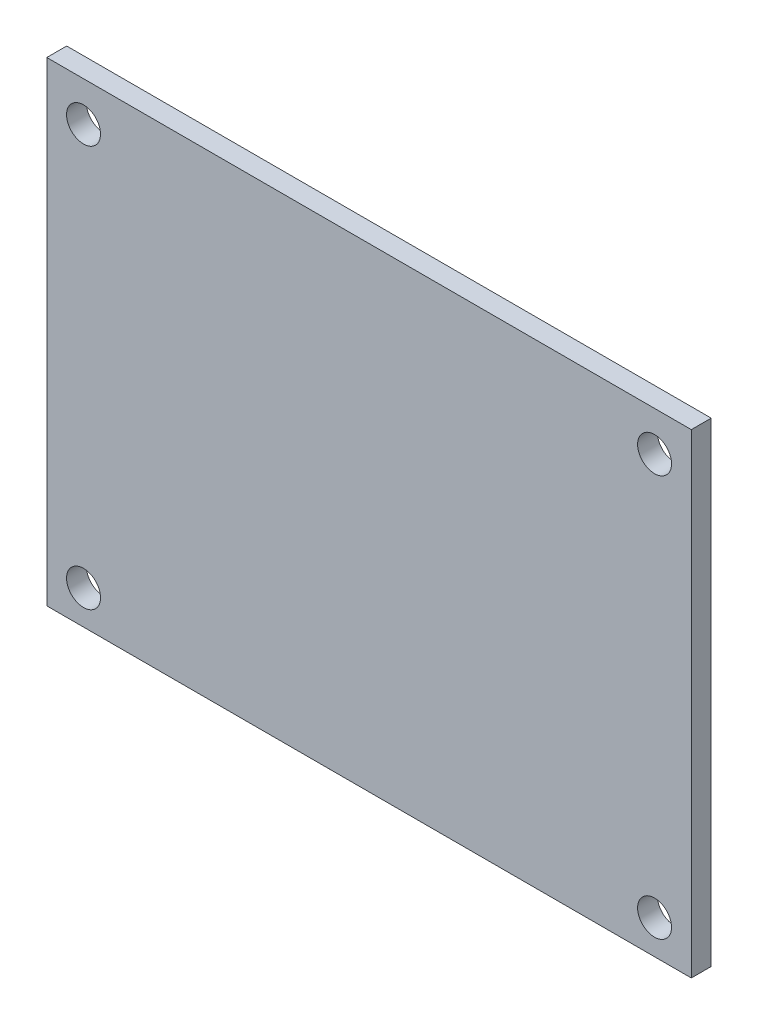
ISO-10303-21;
HEADER;
FILE_DESCRIPTION(('STEP AP214'),'2;1');
FILE_NAME('part.step','',(''),(''),'','','');
FILE_SCHEMA(('AUTOMOTIVE_DESIGN { 1 0 10303 214 1 1 1 1 }'));
ENDSEC;
DATA;
#1=APPLICATION_CONTEXT('core data for automotive mechanical design processes');
#2=APPLICATION_PROTOCOL_DEFINITION('international standard','automotive_design',2000,#1);
#3=PRODUCT_CONTEXT('',#1,'mechanical');
#4=PRODUCT('Part','Part','',(#3));
#5=PRODUCT_RELATED_PRODUCT_CATEGORY('part','',(#4));
#6=PRODUCT_DEFINITION_FORMATION('','',#4);
#7=PRODUCT_DEFINITION_CONTEXT('part definition',#1,'design');
#8=PRODUCT_DEFINITION('design','',#6,#7);
#9=PRODUCT_DEFINITION_SHAPE('','',#8);
#10=(LENGTH_UNIT() NAMED_UNIT(*) SI_UNIT(.MILLI.,.METRE.));
#11=(NAMED_UNIT(*) PLANE_ANGLE_UNIT() SI_UNIT($,.RADIAN.));
#12=(NAMED_UNIT(*) SI_UNIT($,.STERADIAN.) SOLID_ANGLE_UNIT());
#13=UNCERTAINTY_MEASURE_WITH_UNIT(LENGTH_MEASURE(1.E-05),#10,'distance_accuracy_value','');
#14=(GEOMETRIC_REPRESENTATION_CONTEXT(3) GLOBAL_UNCERTAINTY_ASSIGNED_CONTEXT((#13)) GLOBAL_UNIT_ASSIGNED_CONTEXT((#10,
#11,#12)) REPRESENTATION_CONTEXT('',''));
#15=CARTESIAN_POINT('',(0.,0.,0.));
#16=DIRECTION('',(0.,0.,1.));
#17=DIRECTION('',(1.,0.,0.));
#18=AXIS2_PLACEMENT_3D('',#15,#16,#17);
#19=CARTESIAN_POINT('',(28.5,21.,0.));
#20=DIRECTION('',(0.,0.,1.));
#21=DIRECTION('',(1.,0.,0.));
#22=AXIS2_PLACEMENT_3D('',#19,#20,#21);
#23=PLANE('',#22);
#24=CARTESIAN_POINT('',(53.75,3.,0.));
#25=DIRECTION('',(0.,0.,-1.));
#26=DIRECTION('',(1.,0.,0.));
#27=AXIS2_PLACEMENT_3D('',#24,#25,#26);
#28=CIRCLE('',#27,1.5);
#29=CARTESIAN_POINT('',(52.25,3.,0.));
#30=VERTEX_POINT('',#29);
#31=EDGE_CURVE('E132',#30,#30,#28,.T.);
#32=ORIENTED_EDGE('',*,*,#31,.F.);
#33=EDGE_LOOP('',(#32));
#34=FACE_BOUND('',#33,.T.);
#35=CARTESIAN_POINT('',(3.25,3.,0.));
#36=DIRECTION('',(0.,0.,-1.));
#37=DIRECTION('',(1.,0.,0.));
#38=AXIS2_PLACEMENT_3D('',#35,#36,#37);
#39=CIRCLE('',#38,1.5);
#40=CARTESIAN_POINT('',(1.75,3.,0.));
#41=VERTEX_POINT('',#40);
#42=EDGE_CURVE('E125',#41,#41,#39,.T.);
#43=ORIENTED_EDGE('',*,*,#42,.F.);
#44=EDGE_LOOP('',(#43));
#45=FACE_BOUND('',#44,.T.);
#46=CARTESIAN_POINT('',(53.75,38.5,0.));
#47=DIRECTION('',(0.,0.,-1.));
#48=DIRECTION('',(1.,0.,0.));
#49=AXIS2_PLACEMENT_3D('',#46,#47,#48);
#50=CIRCLE('',#49,1.5);
#51=CARTESIAN_POINT('',(52.25,38.5,0.));
#52=VERTEX_POINT('',#51);
#53=EDGE_CURVE('E150',#52,#52,#50,.T.);
#54=ORIENTED_EDGE('',*,*,#53,.F.);
#55=EDGE_LOOP('',(#54));
#56=FACE_BOUND('',#55,.T.);
#57=CARTESIAN_POINT('',(3.25,38.5,0.));
#58=DIRECTION('',(0.,0.,-1.));
#59=DIRECTION('',(1.,0.,0.));
#60=AXIS2_PLACEMENT_3D('',#57,#58,#59);
#61=CIRCLE('',#60,1.5);
#62=CARTESIAN_POINT('',(1.75,38.5,0.));
#63=VERTEX_POINT('',#62);
#64=EDGE_CURVE('E91',#63,#63,#61,.T.);
#65=ORIENTED_EDGE('',*,*,#64,.F.);
#66=EDGE_LOOP('',(#65));
#67=FACE_BOUND('',#66,.T.);
#68=DIRECTION('',(0.,-1.,0.));
#69=VECTOR('',#68,1.);
#70=CARTESIAN_POINT('',(0.,42.,0.));
#71=LINE('',#70,#69);
#72=CARTESIAN_POINT('',(0.,42.,0.));
#73=VERTEX_POINT('',#72);
#74=CARTESIAN_POINT('',(0.,0.,0.));
#75=VERTEX_POINT('',#74);
#76=EDGE_CURVE('E25',#73,#75,#71,.T.);
#77=ORIENTED_EDGE('',*,*,#76,.F.);
#78=DIRECTION('',(-1.,0.,0.));
#79=VECTOR('',#78,1.);
#80=CARTESIAN_POINT('',(57.,42.,0.));
#81=LINE('',#80,#79);
#82=CARTESIAN_POINT('',(57.,42.,0.));
#83=VERTEX_POINT('',#82);
#84=EDGE_CURVE('E156',#83,#73,#81,.T.);
#85=ORIENTED_EDGE('',*,*,#84,.F.);
#86=DIRECTION('',(0.,1.,0.));
#87=VECTOR('',#86,1.);
#88=CARTESIAN_POINT('',(57.,0.,0.));
#89=LINE('',#88,#87);
#90=CARTESIAN_POINT('',(57.,0.,0.));
#91=VERTEX_POINT('',#90);
#92=EDGE_CURVE('E100',#91,#83,#89,.T.);
#93=ORIENTED_EDGE('',*,*,#92,.F.);
#94=DIRECTION('',(1.,0.,0.));
#95=VECTOR('',#94,1.);
#96=CARTESIAN_POINT('',(0.,0.,0.));
#97=LINE('',#96,#95);
#98=EDGE_CURVE('E61',#75,#91,#97,.T.);
#99=ORIENTED_EDGE('',*,*,#98,.F.);
#100=EDGE_LOOP('',(#77,#85,#93,#99));
#101=FACE_BOUND('',#100,.T.);
#102=ADVANCED_FACE('F17',(#34,#45,#56,#67,#101),#23,.F.);
#103=CARTESIAN_POINT('',(28.5,21.,1.76));
#104=DIRECTION('',(0.,0.,1.));
#105=DIRECTION('',(1.,0.,0.));
#106=AXIS2_PLACEMENT_3D('',#103,#104,#105);
#107=PLANE('',#106);
#108=CARTESIAN_POINT('',(53.75,3.,1.76));
#109=DIRECTION('',(0.,0.,-1.));
#110=DIRECTION('',(1.,0.,0.));
#111=AXIS2_PLACEMENT_3D('',#108,#109,#110);
#112=CIRCLE('',#111,1.5);
#113=CARTESIAN_POINT('',(52.25,3.,1.76));
#114=VERTEX_POINT('',#113);
#115=EDGE_CURVE('E264',#114,#114,#112,.T.);
#116=ORIENTED_EDGE('',*,*,#115,.T.);
#117=EDGE_LOOP('',(#116));
#118=FACE_BOUND('',#117,.T.);
#119=CARTESIAN_POINT('',(3.25,3.,1.76));
#120=DIRECTION('',(0.,0.,-1.));
#121=DIRECTION('',(1.,0.,0.));
#122=AXIS2_PLACEMENT_3D('',#119,#120,#121);
#123=CIRCLE('',#122,1.5);
#124=CARTESIAN_POINT('',(1.75,3.,1.76));
#125=VERTEX_POINT('',#124);
#126=EDGE_CURVE('E123',#125,#125,#123,.T.);
#127=ORIENTED_EDGE('',*,*,#126,.T.);
#128=EDGE_LOOP('',(#127));
#129=FACE_BOUND('',#128,.T.);
#130=CARTESIAN_POINT('',(53.75,38.5,1.76));
#131=DIRECTION('',(0.,0.,-1.));
#132=DIRECTION('',(1.,0.,0.));
#133=AXIS2_PLACEMENT_3D('',#130,#131,#132);
#134=CIRCLE('',#133,1.5);
#135=CARTESIAN_POINT('',(52.25,38.5,1.76));
#136=VERTEX_POINT('',#135);
#137=EDGE_CURVE('E151',#136,#136,#134,.T.);
#138=ORIENTED_EDGE('',*,*,#137,.T.);
#139=EDGE_LOOP('',(#138));
#140=FACE_BOUND('',#139,.T.);
#141=CARTESIAN_POINT('',(3.25,38.5,1.76));
#142=DIRECTION('',(0.,0.,-1.));
#143=DIRECTION('',(1.,0.,0.));
#144=AXIS2_PLACEMENT_3D('',#141,#142,#143);
#145=CIRCLE('',#144,1.5);
#146=CARTESIAN_POINT('',(1.75,38.5,1.76));
#147=VERTEX_POINT('',#146);
#148=EDGE_CURVE('E144',#147,#147,#145,.T.);
#149=ORIENTED_EDGE('',*,*,#148,.T.);
#150=EDGE_LOOP('',(#149));
#151=FACE_BOUND('',#150,.T.);
#152=DIRECTION('',(0.,-1.,0.));
#153=VECTOR('',#152,1.);
#154=CARTESIAN_POINT('',(0.,42.,1.76));
#155=LINE('',#154,#153);
#156=CARTESIAN_POINT('',(0.,42.,1.76));
#157=VERTEX_POINT('',#156);
#158=CARTESIAN_POINT('',(0.,0.,1.76));
#159=VERTEX_POINT('',#158);
#160=EDGE_CURVE('E11',#157,#159,#155,.T.);
#161=ORIENTED_EDGE('',*,*,#160,.T.);
#162=DIRECTION('',(1.,0.,0.));
#163=VECTOR('',#162,1.);
#164=CARTESIAN_POINT('',(0.,0.,1.76));
#165=LINE('',#164,#163);
#166=CARTESIAN_POINT('',(57.,0.,1.76));
#167=VERTEX_POINT('',#166);
#168=EDGE_CURVE('E174',#159,#167,#165,.T.);
#169=ORIENTED_EDGE('',*,*,#168,.T.);
#170=DIRECTION('',(0.,1.,0.));
#171=VECTOR('',#170,1.);
#172=CARTESIAN_POINT('',(57.,0.,1.76));
#173=LINE('',#172,#171);
#174=CARTESIAN_POINT('',(57.,42.,1.76));
#175=VERTEX_POINT('',#174);
#176=EDGE_CURVE('E70',#167,#175,#173,.T.);
#177=ORIENTED_EDGE('',*,*,#176,.T.);
#178=DIRECTION('',(-1.,0.,0.));
#179=VECTOR('',#178,1.);
#180=CARTESIAN_POINT('',(57.,42.,1.76));
#181=LINE('',#180,#179);
#182=EDGE_CURVE('E161',#175,#157,#181,.T.);
#183=ORIENTED_EDGE('',*,*,#182,.T.);
#184=EDGE_LOOP('',(#161,#169,#177,#183));
#185=FACE_BOUND('',#184,.T.);
#186=ADVANCED_FACE('F129',(#118,#129,#140,#151,#185),#107,.T.);
#187=CARTESIAN_POINT('',(0.,42.,0.));
#188=DIRECTION('',(-1.,0.,0.));
#189=DIRECTION('',(0.,1.,0.));
#190=AXIS2_PLACEMENT_3D('',#187,#188,#189);
#191=PLANE('',#190);
#192=ORIENTED_EDGE('',*,*,#76,.T.);
#193=DIRECTION('',(0.,0.,1.));
#194=VECTOR('',#193,1.);
#195=CARTESIAN_POINT('',(0.,0.,0.));
#196=LINE('',#195,#194);
#197=EDGE_CURVE('E177',#75,#159,#196,.T.);
#198=ORIENTED_EDGE('',*,*,#197,.T.);
#199=ORIENTED_EDGE('',*,*,#160,.F.);
#200=DIRECTION('',(0.,0.,1.));
#201=VECTOR('',#200,1.);
#202=CARTESIAN_POINT('',(0.,42.,0.));
#203=LINE('',#202,#201);
#204=EDGE_CURVE('E160',#73,#157,#203,.T.);
#205=ORIENTED_EDGE('',*,*,#204,.F.);
#206=EDGE_LOOP('',(#192,#198,#199,#205));
#207=FACE_BOUND('',#206,.T.);
#208=ADVANCED_FACE('F285',(#207),#191,.T.);
#209=CARTESIAN_POINT('',(0.,0.,0.));
#210=DIRECTION('',(0.,-1.,0.));
#211=DIRECTION('',(0.,0.,-1.));
#212=AXIS2_PLACEMENT_3D('',#209,#210,#211);
#213=PLANE('',#212);
#214=ORIENTED_EDGE('',*,*,#98,.T.);
#215=DIRECTION('',(0.,0.,1.));
#216=VECTOR('',#215,1.);
#217=CARTESIAN_POINT('',(57.,0.,0.));
#218=LINE('',#217,#216);
#219=EDGE_CURVE('E169',#91,#167,#218,.T.);
#220=ORIENTED_EDGE('',*,*,#219,.T.);
#221=ORIENTED_EDGE('',*,*,#168,.F.);
#222=ORIENTED_EDGE('',*,*,#197,.F.);
#223=EDGE_LOOP('',(#214,#220,#221,#222));
#224=FACE_BOUND('',#223,.T.);
#225=ADVANCED_FACE('F291',(#224),#213,.T.);
#226=CARTESIAN_POINT('',(57.,0.,0.));
#227=DIRECTION('',(1.,0.,0.));
#228=DIRECTION('',(0.,1.,0.));
#229=AXIS2_PLACEMENT_3D('',#226,#227,#228);
#230=PLANE('',#229);
#231=ORIENTED_EDGE('',*,*,#92,.T.);
#232=DIRECTION('',(0.,0.,1.));
#233=VECTOR('',#232,1.);
#234=CARTESIAN_POINT('',(57.,42.,0.));
#235=LINE('',#234,#233);
#236=EDGE_CURVE('E164',#83,#175,#235,.T.);
#237=ORIENTED_EDGE('',*,*,#236,.T.);
#238=ORIENTED_EDGE('',*,*,#176,.F.);
#239=ORIENTED_EDGE('',*,*,#219,.F.);
#240=EDGE_LOOP('',(#231,#237,#238,#239));
#241=FACE_BOUND('',#240,.T.);
#242=ADVANCED_FACE('F289',(#241),#230,.T.);
#243=CARTESIAN_POINT('',(57.,42.,0.));
#244=DIRECTION('',(0.,1.,0.));
#245=DIRECTION('',(1.,0.,0.));
#246=AXIS2_PLACEMENT_3D('',#243,#244,#245);
#247=PLANE('',#246);
#248=ORIENTED_EDGE('',*,*,#84,.T.);
#249=ORIENTED_EDGE('',*,*,#204,.T.);
#250=ORIENTED_EDGE('',*,*,#182,.F.);
#251=ORIENTED_EDGE('',*,*,#236,.F.);
#252=EDGE_LOOP('',(#248,#249,#250,#251));
#253=FACE_BOUND('',#252,.T.);
#254=ADVANCED_FACE('F288',(#253),#247,.T.);
#255=CARTESIAN_POINT('',(3.25,38.5,0.));
#256=DIRECTION('',(0.,0.,1.));
#257=DIRECTION('',(1.,0.,0.));
#258=AXIS2_PLACEMENT_3D('',#255,#256,#257);
#259=CYLINDRICAL_SURFACE('',#258,1.5);
#260=ORIENTED_EDGE('',*,*,#148,.F.);
#261=DIRECTION('',(0.,0.,-1.));
#262=VECTOR('',#261,1.);
#263=CARTESIAN_POINT('',(1.75,38.5,0.));
#264=LINE('',#263,#262);
#265=EDGE_CURVE('E142',#147,#63,#264,.T.);
#266=ORIENTED_EDGE('',*,*,#265,.T.);
#267=ORIENTED_EDGE('',*,*,#64,.T.);
#268=ORIENTED_EDGE('',*,*,#265,.F.);
#269=EDGE_LOOP('',(#260,#266,#267,#268));
#270=FACE_BOUND('',#269,.T.);
#271=ADVANCED_FACE('F303',(#270),#259,.F.);
#272=CARTESIAN_POINT('',(53.75,38.5,0.));
#273=DIRECTION('',(0.,0.,1.));
#274=DIRECTION('',(1.,0.,0.));
#275=AXIS2_PLACEMENT_3D('',#272,#273,#274);
#276=CYLINDRICAL_SURFACE('',#275,1.5);
#277=ORIENTED_EDGE('',*,*,#137,.F.);
#278=DIRECTION('',(0.,0.,-1.));
#279=VECTOR('',#278,1.);
#280=CARTESIAN_POINT('',(52.25,38.5,0.));
#281=LINE('',#280,#279);
#282=EDGE_CURVE('E146',#136,#52,#281,.T.);
#283=ORIENTED_EDGE('',*,*,#282,.T.);
#284=ORIENTED_EDGE('',*,*,#53,.T.);
#285=ORIENTED_EDGE('',*,*,#282,.F.);
#286=EDGE_LOOP('',(#277,#283,#284,#285));
#287=FACE_BOUND('',#286,.T.);
#288=ADVANCED_FACE('F306',(#287),#276,.F.);
#289=CARTESIAN_POINT('',(3.25,3.,0.));
#290=DIRECTION('',(0.,0.,1.));
#291=DIRECTION('',(1.,0.,0.));
#292=AXIS2_PLACEMENT_3D('',#289,#290,#291);
#293=CYLINDRICAL_SURFACE('',#292,1.5);
#294=ORIENTED_EDGE('',*,*,#126,.F.);
#295=DIRECTION('',(0.,0.,-1.));
#296=VECTOR('',#295,1.);
#297=CARTESIAN_POINT('',(1.75,3.,0.));
#298=LINE('',#297,#296);
#299=EDGE_CURVE('E120',#125,#41,#298,.T.);
#300=ORIENTED_EDGE('',*,*,#299,.T.);
#301=ORIENTED_EDGE('',*,*,#42,.T.);
#302=ORIENTED_EDGE('',*,*,#299,.F.);
#303=EDGE_LOOP('',(#294,#300,#301,#302));
#304=FACE_BOUND('',#303,.T.);
#305=ADVANCED_FACE('F122',(#304),#293,.F.);
#306=CARTESIAN_POINT('',(53.75,3.,0.));
#307=DIRECTION('',(0.,0.,1.));
#308=DIRECTION('',(1.,0.,0.));
#309=AXIS2_PLACEMENT_3D('',#306,#307,#308);
#310=CYLINDRICAL_SURFACE('',#309,1.5);
#311=ORIENTED_EDGE('',*,*,#115,.F.);
#312=DIRECTION('',(0.,0.,-1.));
#313=VECTOR('',#312,1.);
#314=CARTESIAN_POINT('',(52.25,3.,0.));
#315=LINE('',#314,#313);
#316=EDGE_CURVE('E138',#114,#30,#315,.T.);
#317=ORIENTED_EDGE('',*,*,#316,.T.);
#318=ORIENTED_EDGE('',*,*,#31,.T.);
#319=ORIENTED_EDGE('',*,*,#316,.F.);
#320=EDGE_LOOP('',(#311,#317,#318,#319));
#321=FACE_BOUND('',#320,.T.);
#322=ADVANCED_FACE('F275',(#321),#310,.F.);
#323=CLOSED_SHELL('',(#102,#186,#208,#225,#242,#254,#271,#288,#305,#322));
#324=MANIFOLD_SOLID_BREP('B1',#323);
#325=ADVANCED_BREP_SHAPE_REPRESENTATION('',(#18,#324),#14);
#326=SHAPE_DEFINITION_REPRESENTATION(#9,#325);
ENDSEC;
END-ISO-10303-21;
